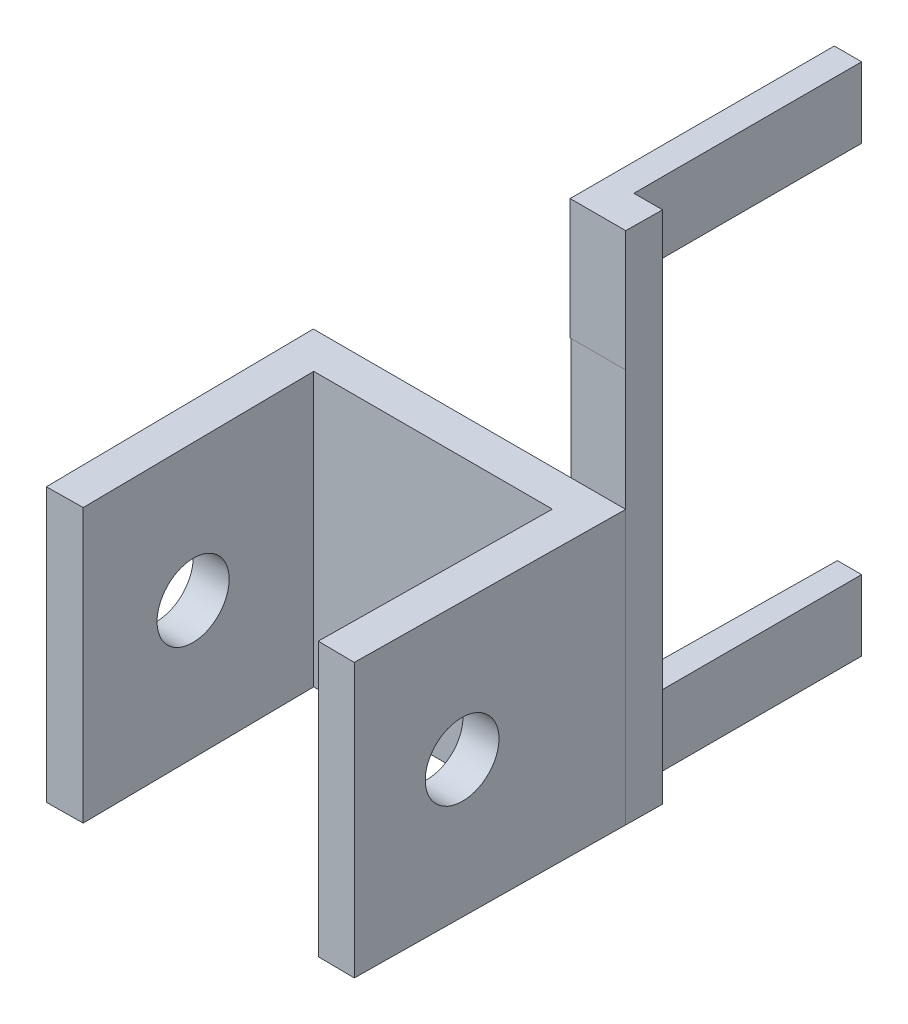
ISO-10303-21;
HEADER;
FILE_DESCRIPTION(('STEP AP214'),'2;1');
FILE_NAME('part.step','',(''),(''),'','','');
FILE_SCHEMA(('AUTOMOTIVE_DESIGN { 1 0 10303 214 1 1 1 1 }'));
ENDSEC;
DATA;
#1=APPLICATION_CONTEXT('core data for automotive mechanical design processes');
#2=APPLICATION_PROTOCOL_DEFINITION('international standard','automotive_design',2000,#1);
#3=PRODUCT_CONTEXT('',#1,'mechanical');
#4=PRODUCT('Part','Part','',(#3));
#5=PRODUCT_RELATED_PRODUCT_CATEGORY('part','',(#4));
#6=PRODUCT_DEFINITION_FORMATION('','',#4);
#7=PRODUCT_DEFINITION_CONTEXT('part definition',#1,'design');
#8=PRODUCT_DEFINITION('design','',#6,#7);
#9=PRODUCT_DEFINITION_SHAPE('','',#8);
#10=(LENGTH_UNIT() NAMED_UNIT(*) SI_UNIT(.MILLI.,.METRE.));
#11=(NAMED_UNIT(*) PLANE_ANGLE_UNIT() SI_UNIT($,.RADIAN.));
#12=(NAMED_UNIT(*) SI_UNIT($,.STERADIAN.) SOLID_ANGLE_UNIT());
#13=UNCERTAINTY_MEASURE_WITH_UNIT(LENGTH_MEASURE(1.E-05),#10,'distance_accuracy_value','');
#14=(GEOMETRIC_REPRESENTATION_CONTEXT(3) GLOBAL_UNCERTAINTY_ASSIGNED_CONTEXT((#13)) GLOBAL_UNIT_ASSIGNED_CONTEXT((#10,
#11,#12)) REPRESENTATION_CONTEXT('',''));
#15=CARTESIAN_POINT('',(0.,0.,0.));
#16=DIRECTION('',(0.,0.,1.));
#17=DIRECTION('',(1.,0.,0.));
#18=AXIS2_PLACEMENT_3D('',#15,#16,#17);
#19=CARTESIAN_POINT('',(28.338155167548,26.2685783752968,31.8283811231663));
#20=DIRECTION('',(0.,0.,-1.));
#21=DIRECTION('',(1.,0.,0.));
#22=AXIS2_PLACEMENT_3D('',#19,#20,#21);
#23=PLANE('',#22);
#24=DIRECTION('',(0.,1.,0.));
#25=VECTOR('',#24,1.);
#26=CARTESIAN_POINT('',(26.2379684492767,61.7685783752968,31.8283811231663));
#27=LINE('',#26,#25);
#28=CARTESIAN_POINT('',(26.2379684492767,56.2685783752968,31.8283811231663));
#29=VERTEX_POINT('',#28);
#30=CARTESIAN_POINT('',(26.2379684492767,69.5185783752968,31.8283811231663));
#31=VERTEX_POINT('',#30);
#32=EDGE_CURVE('P0_E219',#29,#31,#27,.T.);
#33=ORIENTED_EDGE('',*,*,#32,.F.);
#34=DIRECTION('',(-1.,0.,0.));
#35=VECTOR('',#34,1.);
#36=CARTESIAN_POINT('',(15.238155167548,56.2685783752968,31.8283811231663));
#37=LINE('',#36,#35);
#38=CARTESIAN_POINT('',(32.3384298163221,56.2685783752968,31.8283811231663));
#39=VERTEX_POINT('',#38);
#40=EDGE_CURVE('P0_E147',#39,#29,#37,.T.);
#41=ORIENTED_EDGE('',*,*,#40,.F.);
#42=DIRECTION('',(0.,1.,0.));
#43=VECTOR('',#42,1.);
#44=CARTESIAN_POINT('',(32.3384298163221,69.5185783752968,31.8283811231663));
#45=LINE('',#44,#43);
#46=CARTESIAN_POINT('',(32.3384298163221,69.5185783752968,31.8283811231663));
#47=VERTEX_POINT('',#46);
#48=EDGE_CURVE('P0_E174',#39,#47,#45,.T.);
#49=ORIENTED_EDGE('',*,*,#48,.T.);
#50=DIRECTION('',(1.,0.,0.));
#51=VECTOR('',#50,1.);
#52=CARTESIAN_POINT('',(26.2379684492767,69.5185783752968,31.8283811231663));
#53=LINE('',#52,#51);
#54=EDGE_CURVE('P0_E167',#31,#47,#53,.T.);
#55=ORIENTED_EDGE('',*,*,#54,.F.);
#56=EDGE_LOOP('',(#33,#41,#49,#55));
#57=FACE_BOUND('',#56,.T.);
#58=ADVANCED_FACE('P0_F16',(#57),#23,.F.);
#59=CARTESIAN_POINT('',(29.2379684492767,20.7685783752968,31.8283811231663));
#60=DIRECTION('',(1.,0.,0.));
#61=DIRECTION('',(0.,0.,1.));
#62=AXIS2_PLACEMENT_3D('',#59,#60,#61);
#63=PLANE('',#62);
#64=DIRECTION('',(0.,0.,1.));
#65=VECTOR('',#64,1.);
#66=CARTESIAN_POINT('',(29.2379684492767,69.5185783752968,2.82838112316626));
#67=LINE('',#66,#65);
#68=CARTESIAN_POINT('',(29.2379684492767,69.5185783752968,2.82838112316626));
#69=VERTEX_POINT('',#68);
#70=CARTESIAN_POINT('',(29.2379684492767,69.5185783752968,27.8283811231663));
#71=VERTEX_POINT('',#70);
#72=EDGE_CURVE('P0_E39',#69,#71,#67,.T.);
#73=ORIENTED_EDGE('',*,*,#72,.T.);
#74=DIRECTION('',(0.,1.,0.));
#75=VECTOR('',#74,1.);
#76=CARTESIAN_POINT('',(29.2379684492767,13.0185783752968,27.8283811231663));
#77=LINE('',#76,#75);
#78=CARTESIAN_POINT('',(29.2379684492767,61.7685783752968,27.8283811231663));
#79=VERTEX_POINT('',#78);
#80=EDGE_CURVE('P0_E152',#79,#71,#77,.T.);
#81=ORIENTED_EDGE('',*,*,#80,.F.);
#82=DIRECTION('',(0.,0.,1.));
#83=VECTOR('',#82,1.);
#84=CARTESIAN_POINT('',(29.2379684492767,61.7685783752968,2.82838112316626));
#85=LINE('',#84,#83);
#86=CARTESIAN_POINT('',(29.2379684492767,61.7685783752968,2.82838112316626));
#87=VERTEX_POINT('',#86);
#88=EDGE_CURVE('P0_E189',#87,#79,#85,.T.);
#89=ORIENTED_EDGE('',*,*,#88,.F.);
#90=DIRECTION('',(0.,-1.,0.));
#91=VECTOR('',#90,1.);
#92=CARTESIAN_POINT('',(29.2379684492767,61.7685783752968,2.82838112316626));
#93=LINE('',#92,#91);
#94=EDGE_CURVE('P0_E183',#69,#87,#93,.T.);
#95=ORIENTED_EDGE('',*,*,#94,.F.);
#96=EDGE_LOOP('',(#73,#81,#89,#95));
#97=FACE_BOUND('',#96,.T.);
#98=ADVANCED_FACE('P0_F289',(#97),#63,.T.);
#99=DIRECTION('',(0.,0.,1.));
#100=VECTOR('',#99,1.);
#101=CARTESIAN_POINT('',(29.2379684492767,20.7685783752968,2.82838112316626));
#102=LINE('',#101,#100);
#103=CARTESIAN_POINT('',(29.2379684492767,20.7685783752968,2.82838112316626));
#104=VERTEX_POINT('',#103);
#105=CARTESIAN_POINT('',(29.2379684492767,20.7685783752968,27.8283811231663));
#106=VERTEX_POINT('',#105);
#107=EDGE_CURVE('P0_E211',#104,#106,#102,.T.);
#108=ORIENTED_EDGE('',*,*,#107,.T.);
#109=CARTESIAN_POINT('',(29.2379684492767,13.0185783752968,27.8283811231663));
#110=VERTEX_POINT('',#109);
#111=EDGE_CURVE('P0_E155',#110,#106,#77,.T.);
#112=ORIENTED_EDGE('',*,*,#111,.F.);
#113=DIRECTION('',(0.,0.,1.));
#114=VECTOR('',#113,1.);
#115=CARTESIAN_POINT('',(29.2379684492767,13.0185783752968,2.82838112316626));
#116=LINE('',#115,#114);
#117=CARTESIAN_POINT('',(29.2379684492767,13.0185783752968,2.82838112316626));
#118=VERTEX_POINT('',#117);
#119=EDGE_CURVE('P0_E208',#118,#110,#116,.T.);
#120=ORIENTED_EDGE('',*,*,#119,.F.);
#121=DIRECTION('',(0.,-1.,0.));
#122=VECTOR('',#121,1.);
#123=CARTESIAN_POINT('',(29.2379684492767,20.7685783752968,2.82838112316626));
#124=LINE('',#123,#122);
#125=EDGE_CURVE('P0_E201',#104,#118,#124,.T.);
#126=ORIENTED_EDGE('',*,*,#125,.F.);
#127=EDGE_LOOP('',(#108,#112,#120,#126));
#128=FACE_BOUND('',#127,.T.);
#129=ADVANCED_FACE('P0_F260',(#128),#63,.T.);
#130=DIRECTION('',(-1.,0.,0.));
#131=VECTOR('',#130,1.);
#132=CARTESIAN_POINT('',(15.238155167548,26.2685783752968,31.8283811231663));
#133=LINE('',#132,#131);
#134=CARTESIAN_POINT('',(32.3384298163221,26.2685783752968,31.8283811231663));
#135=VERTEX_POINT('',#134);
#136=CARTESIAN_POINT('',(26.2379684492767,26.2685783752968,31.8283811231663));
#137=VERTEX_POINT('',#136);
#138=EDGE_CURVE('P0_E218',#135,#137,#133,.T.);
#139=ORIENTED_EDGE('',*,*,#138,.T.);
#140=CARTESIAN_POINT('',(26.2379684492767,13.0185783752968,31.8283811231663));
#141=VERTEX_POINT('',#140);
#142=EDGE_CURVE('P0_E215',#141,#137,#27,.T.);
#143=ORIENTED_EDGE('',*,*,#142,.F.);
#144=DIRECTION('',(-1.,0.,0.));
#145=VECTOR('',#144,1.);
#146=CARTESIAN_POINT('',(26.2379684492767,13.0185783752968,31.8283811231663));
#147=LINE('',#146,#145);
#148=CARTESIAN_POINT('',(32.3384298163221,13.0185783752968,31.8283811231663));
#149=VERTEX_POINT('',#148);
#150=EDGE_CURVE('P0_E196',#149,#141,#147,.T.);
#151=ORIENTED_EDGE('',*,*,#150,.F.);
#152=EDGE_CURVE('P0_E165',#149,#135,#45,.T.);
#153=ORIENTED_EDGE('',*,*,#152,.T.);
#154=EDGE_LOOP('',(#139,#143,#151,#153));
#155=FACE_BOUND('',#154,.T.);
#156=ADVANCED_FACE('P0_F18',(#155),#23,.F.);
#157=CARTESIAN_POINT('',(32.3853048163221,26.2685783752968,27.8283811231663));
#158=DIRECTION('',(0.,0.,1.));
#159=DIRECTION('',(-1.,0.,0.));
#160=AXIS2_PLACEMENT_3D('',#157,#158,#159);
#161=PLANE('',#160);
#162=DIRECTION('',(0.,1.,0.));
#163=VECTOR('',#162,1.);
#164=CARTESIAN_POINT('',(26.2840056783981,26.2685783752968,27.8283811231663));
#165=LINE('',#164,#163);
#166=CARTESIAN_POINT('',(26.2840056783981,20.7685783752968,27.8283811231663));
#167=VERTEX_POINT('',#166);
#168=CARTESIAN_POINT('',(26.2840056783981,56.2685783752968,27.8283811231663));
#169=VERTEX_POINT('',#168);
#170=EDGE_CURVE('P0_E268',#167,#169,#165,.T.);
#171=ORIENTED_EDGE('',*,*,#170,.T.);
#172=DIRECTION('',(-0.956445869362801,0.291909744576703,0.));
#173=VECTOR('',#172,1.);
#174=CARTESIAN_POINT('',(40.2412812741353,52.008781888484,27.8283811231663));
#175=LINE('',#174,#173);
#176=CARTESIAN_POINT('',(26.2379684492767,56.282629056286,27.8283811231663));
#177=VERTEX_POINT('',#176);
#178=EDGE_CURVE('P0_E124',#169,#177,#175,.T.);
#179=ORIENTED_EDGE('',*,*,#178,.T.);
#180=DIRECTION('',(0.,1.,0.));
#181=VECTOR('',#180,1.);
#182=CARTESIAN_POINT('',(26.2379684492767,61.7685783752968,27.8283811231663));
#183=LINE('',#182,#181);
#184=CARTESIAN_POINT('',(26.2379684492767,61.7685783752968,27.8283811231663));
#185=VERTEX_POINT('',#184);
#186=EDGE_CURVE('P0_E141',#177,#185,#183,.T.);
#187=ORIENTED_EDGE('',*,*,#186,.T.);
#188=DIRECTION('',(1.,0.,0.));
#189=VECTOR('',#188,1.);
#190=CARTESIAN_POINT('',(26.2379684492767,61.7685783752968,27.8283811231663));
#191=LINE('',#190,#189);
#192=EDGE_CURVE('P0_E214',#185,#79,#191,.T.);
#193=ORIENTED_EDGE('',*,*,#192,.T.);
#194=ORIENTED_EDGE('',*,*,#80,.T.);
#195=DIRECTION('',(-1.,0.,0.));
#196=VECTOR('',#195,1.);
#197=CARTESIAN_POINT('',(89.0052278210073,69.5185783752968,27.8283811231663));
#198=LINE('',#197,#196);
#199=CARTESIAN_POINT('',(32.3853048163221,69.5185783752968,27.8283811231663));
#200=VERTEX_POINT('',#199);
#201=EDGE_CURVE('P0_E169',#200,#71,#198,.T.);
#202=ORIENTED_EDGE('',*,*,#201,.F.);
#203=DIRECTION('',(0.,1.,0.));
#204=VECTOR('',#203,1.);
#205=CARTESIAN_POINT('',(32.3853048163221,26.2685783752968,27.8283811231663));
#206=LINE('',#205,#204);
#207=CARTESIAN_POINT('',(32.3853048163221,13.0185783752968,27.8283811231663));
#208=VERTEX_POINT('',#207);
#209=EDGE_CURVE('P0_E230',#208,#200,#206,.T.);
#210=ORIENTED_EDGE('',*,*,#209,.F.);
#211=DIRECTION('',(-1.,0.,0.));
#212=VECTOR('',#211,1.);
#213=CARTESIAN_POINT('',(89.0052278210073,13.0185783752968,27.8283811231662));
#214=LINE('',#213,#212);
#215=EDGE_CURVE('P0_E172',#208,#110,#214,.T.);
#216=ORIENTED_EDGE('',*,*,#215,.T.);
#217=ORIENTED_EDGE('',*,*,#111,.T.);
#218=DIRECTION('',(-1.,0.,0.));
#219=VECTOR('',#218,1.);
#220=CARTESIAN_POINT('',(26.2379684492767,20.7685783752968,27.8283811231663));
#221=LINE('',#220,#219);
#222=EDGE_CURVE('P0_E222',#106,#167,#221,.T.);
#223=ORIENTED_EDGE('',*,*,#222,.T.);
#224=EDGE_LOOP('',(#171,#179,#187,#193,#194,#202,#210,#216,#217,#223));
#225=FACE_BOUND('',#224,.T.);
#226=ADVANCED_FACE('P0_F241',(#225),#161,.F.);
#227=CARTESIAN_POINT('',(32.0378805376306,26.2685783752968,57.4752529048469));
#228=DIRECTION('',(-0.99993134252064,0.,-0.0117179454201636));
#229=DIRECTION('',(0.0117179454201636,0.,-0.99993134252064));
#230=AXIS2_PLACEMENT_3D('',#227,#228,#229);
#231=PLANE('',#230);
#232=ORIENTED_EDGE('',*,*,#48,.F.);
#233=DIRECTION('',(0.,1.,0.));
#234=VECTOR('',#233,1.);
#235=CARTESIAN_POINT('',(32.3384298163221,26.2685783752968,31.8283811231663));
#236=LINE('',#235,#234);
#237=EDGE_CURVE('P0_E151',#135,#39,#236,.T.);
#238=ORIENTED_EDGE('',*,*,#237,.F.);
#239=ORIENTED_EDGE('',*,*,#152,.F.);
#240=DIRECTION('',(-0.0117179454201636,0.,0.99993134252064));
#241=VECTOR('',#240,1.);
#242=CARTESIAN_POINT('',(32.3462107482322,13.0185783752968,31.1644082668447));
#243=LINE('',#242,#241);
#244=EDGE_CURVE('P0_E164',#208,#149,#243,.T.);
#245=ORIENTED_EDGE('',*,*,#244,.F.);
#246=ORIENTED_EDGE('',*,*,#209,.T.);
#247=DIRECTION('',(0.0117179454201636,0.,-0.99993134252064));
#248=VECTOR('',#247,1.);
#249=CARTESIAN_POINT('',(32.3462107482322,69.5185783752968,31.1644082668447));
#250=LINE('',#249,#248);
#251=EDGE_CURVE('P0_E161',#47,#200,#250,.T.);
#252=ORIENTED_EDGE('',*,*,#251,.F.);
#253=EDGE_LOOP('',(#232,#238,#239,#245,#246,#252));
#254=FACE_BOUND('',#253,.T.);
#255=ADVANCED_FACE('P0_F237',(#254),#231,.F.);
#256=CARTESIAN_POINT('',(26.2379684492767,61.7685783752968,31.8283811231663));
#257=DIRECTION('',(-1.,0.,0.));
#258=DIRECTION('',(0.,-1.,0.));
#259=AXIS2_PLACEMENT_3D('',#256,#257,#258);
#260=PLANE('',#259);
#261=DIRECTION('',(0.,0.00357656982948041,-0.999993604053673));
#262=VECTOR('',#261,1.);
#263=CARTESIAN_POINT('',(26.2379684492767,56.2683930439206,31.808709200433));
#264=LINE('',#263,#262);
#265=CARTESIAN_POINT('',(26.2379684492767,56.2685783752968,31.7568913415212));
#266=VERTEX_POINT('',#265);
#267=EDGE_CURVE('P0_E10',#266,#177,#264,.T.);
#268=ORIENTED_EDGE('',*,*,#267,.F.);
#269=DIRECTION('',(0.,0.,-1.));
#270=VECTOR('',#269,1.);
#271=CARTESIAN_POINT('',(26.2379684492767,56.2685783752968,44.6283811231663));
#272=LINE('',#271,#270);
#273=EDGE_CURVE('P0_E133',#29,#266,#272,.T.);
#274=ORIENTED_EDGE('',*,*,#273,.F.);
#275=ORIENTED_EDGE('',*,*,#32,.T.);
#276=DIRECTION('',(0.,0.,1.));
#277=VECTOR('',#276,1.);
#278=CARTESIAN_POINT('',(26.2379684492767,69.5185783752968,2.82838112316627));
#279=LINE('',#278,#277);
#280=CARTESIAN_POINT('',(26.2379684492767,69.5185783752968,2.82838112316627));
#281=VERTEX_POINT('',#280);
#282=EDGE_CURVE('P0_E193',#281,#31,#279,.T.);
#283=ORIENTED_EDGE('',*,*,#282,.F.);
#284=DIRECTION('',(0.,1.,0.));
#285=VECTOR('',#284,1.);
#286=CARTESIAN_POINT('',(26.2379684492767,61.7685783752968,2.82838112316627));
#287=LINE('',#286,#285);
#288=CARTESIAN_POINT('',(26.2379684492767,61.7685783752968,2.82838112316627));
#289=VERTEX_POINT('',#288);
#290=EDGE_CURVE('P0_E178',#289,#281,#287,.T.);
#291=ORIENTED_EDGE('',*,*,#290,.F.);
#292=DIRECTION('',(0.,0.,1.));
#293=VECTOR('',#292,1.);
#294=CARTESIAN_POINT('',(26.2379684492767,61.7685783752968,2.82838112316627));
#295=LINE('',#294,#293);
#296=EDGE_CURVE('P0_E187',#289,#185,#295,.T.);
#297=ORIENTED_EDGE('',*,*,#296,.T.);
#298=ORIENTED_EDGE('',*,*,#186,.F.);
#299=EDGE_LOOP('',(#268,#274,#275,#283,#291,#297,#298));
#300=FACE_BOUND('',#299,.T.);
#301=ADVANCED_FACE('P0_F138',(#300),#260,.T.);
#302=DIRECTION('',(0.,1.,0.));
#303=VECTOR('',#302,1.);
#304=CARTESIAN_POINT('',(26.2379684492767,56.2685783752968,31.7568913415212));
#305=LINE('',#304,#303);
#306=CARTESIAN_POINT('',(26.2379684492767,13.0185783752968,31.7568913415212));
#307=VERTEX_POINT('',#306);
#308=CARTESIAN_POINT('',(26.2379684492767,26.2685783752968,31.7568913415212));
#309=VERTEX_POINT('',#308);
#310=EDGE_CURVE('P0_E31',#307,#309,#305,.T.);
#311=ORIENTED_EDGE('',*,*,#310,.F.);
#312=DIRECTION('',(0.,0.,1.));
#313=VECTOR('',#312,1.);
#314=CARTESIAN_POINT('',(26.2379684492767,13.0185783752968,2.82838112316627));
#315=LINE('',#314,#313);
#316=EDGE_CURVE('P0_E206',#307,#141,#315,.T.);
#317=ORIENTED_EDGE('',*,*,#316,.T.);
#318=ORIENTED_EDGE('',*,*,#142,.T.);
#319=DIRECTION('',(0.,0.,-1.));
#320=VECTOR('',#319,1.);
#321=CARTESIAN_POINT('',(26.2379684492767,26.2685783752968,44.6283811231663));
#322=LINE('',#321,#320);
#323=EDGE_CURVE('P0_E227',#137,#309,#322,.T.);
#324=ORIENTED_EDGE('',*,*,#323,.T.);
#325=EDGE_LOOP('',(#311,#317,#318,#324));
#326=FACE_BOUND('',#325,.T.);
#327=ADVANCED_FACE('P0_F303',(#326),#260,.T.);
#328=CARTESIAN_POINT('',(26.2379684492767,20.7685783752968,2.82838112316627));
#329=DIRECTION('',(0.,-1.,0.));
#330=DIRECTION('',(0.,0.,1.));
#331=AXIS2_PLACEMENT_3D('',#328,#329,#330);
#332=PLANE('',#331);
#333=DIRECTION('',(1.,0.,0.));
#334=VECTOR('',#333,1.);
#335=CARTESIAN_POINT('',(26.2379684492767,20.7685783752968,2.82838112316627));
#336=LINE('',#335,#334);
#337=CARTESIAN_POINT('',(26.5769744283981,20.7685783752968,2.82838112316627));
#338=VERTEX_POINT('',#337);
#339=EDGE_CURVE('P0_E199',#338,#104,#336,.T.);
#340=ORIENTED_EDGE('',*,*,#339,.F.);
#341=DIRECTION('',(-0.0117179454201636,0.,0.99993134252064));
#342=VECTOR('',#341,1.);
#343=CARTESIAN_POINT('',(26.5769278794041,20.7685783752968,2.83235330398807));
#344=LINE('',#343,#342);
#345=EDGE_CURVE('P0_E267',#338,#167,#344,.T.);
#346=ORIENTED_EDGE('',*,*,#345,.T.);
#347=ORIENTED_EDGE('',*,*,#222,.F.);
#348=ORIENTED_EDGE('',*,*,#107,.F.);
#349=EDGE_LOOP('',(#340,#346,#347,#348));
#350=FACE_BOUND('',#349,.T.);
#351=ADVANCED_FACE('P0_F265',(#350),#332,.F.);
#352=CARTESIAN_POINT('',(26.2379684492767,13.0185783752968,2.82838112316627));
#353=DIRECTION('',(0.,1.,0.));
#354=DIRECTION('',(0.,0.,-1.));
#355=AXIS2_PLACEMENT_3D('',#352,#353,#354);
#356=PLANE('',#355);
#357=ORIENTED_EDGE('',*,*,#316,.F.);
#358=DIRECTION('',(0.0117179454201636,0.,-0.99993134252064));
#359=VECTOR('',#358,1.);
#360=CARTESIAN_POINT('',(26.5769278794041,13.0185783752968,2.83235330398807));
#361=LINE('',#360,#359);
#362=CARTESIAN_POINT('',(26.5769744283981,13.0185783752968,2.82838112316627));
#363=VERTEX_POINT('',#362);
#364=EDGE_CURVE('P0_E270',#307,#363,#361,.T.);
#365=ORIENTED_EDGE('',*,*,#364,.T.);
#366=DIRECTION('',(-1.,0.,0.));
#367=VECTOR('',#366,1.);
#368=CARTESIAN_POINT('',(26.2379684492767,13.0185783752968,2.82838112316627));
#369=LINE('',#368,#367);
#370=EDGE_CURVE('P0_E203',#118,#363,#369,.T.);
#371=ORIENTED_EDGE('',*,*,#370,.F.);
#372=ORIENTED_EDGE('',*,*,#119,.T.);
#373=ORIENTED_EDGE('',*,*,#215,.F.);
#374=ORIENTED_EDGE('',*,*,#244,.T.);
#375=ORIENTED_EDGE('',*,*,#150,.T.);
#376=EDGE_LOOP('',(#357,#365,#371,#372,#373,#374,#375));
#377=FACE_BOUND('',#376,.T.);
#378=ADVANCED_FACE('P0_F253',(#377),#356,.F.);
#379=CARTESIAN_POINT('',(15.238155167548,56.2685783752968,2.82838112316627));
#380=DIRECTION('',(0.,0.,-1.));
#381=DIRECTION('',(1.,0.,0.));
#382=AXIS2_PLACEMENT_3D('',#379,#380,#381);
#383=PLANE('',#382);
#384=DIRECTION('',(0.,-1.,0.));
#385=VECTOR('',#384,1.);
#386=CARTESIAN_POINT('',(26.5769744283981,56.2685783752968,2.82838112316627));
#387=LINE('',#386,#385);
#388=EDGE_CURVE('P0_E126',#338,#363,#387,.T.);
#389=ORIENTED_EDGE('',*,*,#388,.F.);
#390=ORIENTED_EDGE('',*,*,#339,.T.);
#391=ORIENTED_EDGE('',*,*,#125,.T.);
#392=ORIENTED_EDGE('',*,*,#370,.T.);
#393=EDGE_LOOP('',(#389,#390,#391,#392));
#394=FACE_BOUND('',#393,.T.);
#395=ADVANCED_FACE('P0_F277',(#394),#383,.T.);
#396=CARTESIAN_POINT('',(26.2379684492767,69.5185783752968,2.82838112316627));
#397=DIRECTION('',(0.,-1.,0.));
#398=DIRECTION('',(0.,0.,1.));
#399=AXIS2_PLACEMENT_3D('',#396,#397,#398);
#400=PLANE('',#399);
#401=ORIENTED_EDGE('',*,*,#282,.T.);
#402=ORIENTED_EDGE('',*,*,#54,.T.);
#403=ORIENTED_EDGE('',*,*,#251,.T.);
#404=ORIENTED_EDGE('',*,*,#201,.T.);
#405=ORIENTED_EDGE('',*,*,#72,.F.);
#406=DIRECTION('',(1.,0.,0.));
#407=VECTOR('',#406,1.);
#408=CARTESIAN_POINT('',(26.2379684492767,69.5185783752968,2.82838112316627));
#409=LINE('',#408,#407);
#410=EDGE_CURVE('P0_E181',#281,#69,#409,.T.);
#411=ORIENTED_EDGE('',*,*,#410,.F.);
#412=EDGE_LOOP('',(#401,#402,#403,#404,#405,#411));
#413=FACE_BOUND('',#412,.T.);
#414=ADVANCED_FACE('P0_F243',(#413),#400,.F.);
#415=CARTESIAN_POINT('',(26.2379684492767,61.7685783752968,2.82838112316627));
#416=DIRECTION('',(0.,1.,0.));
#417=DIRECTION('',(0.,0.,-1.));
#418=AXIS2_PLACEMENT_3D('',#415,#416,#417);
#419=PLANE('',#418);
#420=ORIENTED_EDGE('',*,*,#192,.F.);
#421=ORIENTED_EDGE('',*,*,#296,.F.);
#422=DIRECTION('',(-1.,0.,0.));
#423=VECTOR('',#422,1.);
#424=CARTESIAN_POINT('',(26.2379684492767,61.7685783752968,2.82838112316627));
#425=LINE('',#424,#423);
#426=EDGE_CURVE('P0_E185',#87,#289,#425,.T.);
#427=ORIENTED_EDGE('',*,*,#426,.F.);
#428=ORIENTED_EDGE('',*,*,#88,.T.);
#429=EDGE_LOOP('',(#420,#421,#427,#428));
#430=FACE_BOUND('',#429,.T.);
#431=ADVANCED_FACE('P0_F285',(#430),#419,.F.);
#432=CARTESIAN_POINT('',(15.238155167548,56.2685783752968,2.82838112316627));
#433=DIRECTION('',(0.,0.,-1.));
#434=DIRECTION('',(1.,0.,0.));
#435=AXIS2_PLACEMENT_3D('',#432,#433,#434);
#436=PLANE('',#435);
#437=ORIENTED_EDGE('',*,*,#290,.T.);
#438=ORIENTED_EDGE('',*,*,#410,.T.);
#439=ORIENTED_EDGE('',*,*,#94,.T.);
#440=ORIENTED_EDGE('',*,*,#426,.T.);
#441=EDGE_LOOP('',(#437,#438,#439,#440));
#442=FACE_BOUND('',#441,.T.);
#443=ADVANCED_FACE('P0_F328',(#442),#436,.T.);
#444=CARTESIAN_POINT('',(-14.658343282148,26.2685783752968,31.2776376884186));
#445=DIRECTION('',(0.0117179454201636,0.,-0.99993134252064));
#446=DIRECTION('',(0.99993134252064,0.,0.0117179454201636));
#447=AXIS2_PLACEMENT_3D('',#444,#445,#446);
#448=PLANE('',#447);
#449=DIRECTION('',(0.99993134252064,0.,0.0117179454201636));
#450=VECTOR('',#449,1.);
#451=CARTESIAN_POINT('',(-14.658343282148,56.2685783752968,31.2776376884186));
#452=LINE('',#451,#450);
#453=EDGE_CURVE('P0_E144',#266,#39,#452,.T.);
#454=ORIENTED_EDGE('',*,*,#453,.F.);
#455=DIRECTION('',(0.,-1.,0.));
#456=VECTOR('',#455,1.);
#457=CARTESIAN_POINT('',(26.2379684492767,26.2685783752968,31.7568913415212));
#458=LINE('',#457,#456);
#459=EDGE_CURVE('P0_E24',#266,#309,#458,.T.);
#460=ORIENTED_EDGE('',*,*,#459,.T.);
#461=DIRECTION('',(0.99993134252064,0.,0.0117179454201636));
#462=VECTOR('',#461,1.);
#463=CARTESIAN_POINT('',(-14.658343282148,26.2685783752968,31.2776376884186));
#464=LINE('',#463,#462);
#465=EDGE_CURVE('P0_E153',#309,#135,#464,.T.);
#466=ORIENTED_EDGE('',*,*,#465,.T.);
#467=ORIENTED_EDGE('',*,*,#237,.T.);
#468=EDGE_LOOP('',(#454,#460,#466,#467));
#469=FACE_BOUND('',#468,.T.);
#470=ADVANCED_FACE('P0_F149',(#469),#448,.F.);
#471=CARTESIAN_POINT('',(-14.658343282148,56.2685783752968,31.2776376884186));
#472=DIRECTION('',(0.,1.,0.));
#473=DIRECTION('',(0.,0.,-1.));
#474=AXIS2_PLACEMENT_3D('',#471,#472,#473);
#475=PLANE('',#474);
#476=ORIENTED_EDGE('',*,*,#40,.T.);
#477=ORIENTED_EDGE('',*,*,#273,.T.);
#478=ORIENTED_EDGE('',*,*,#453,.T.);
#479=EDGE_LOOP('',(#476,#477,#478));
#480=FACE_BOUND('',#479,.T.);
#481=ADVANCED_FACE('P0_F143',(#480),#475,.F.);
#482=CARTESIAN_POINT('',(-14.9959516984278,26.2685783752968,60.0868892109664));
#483=DIRECTION('',(0.,-1.,0.));
#484=DIRECTION('',(0.,0.,1.));
#485=AXIS2_PLACEMENT_3D('',#482,#483,#484);
#486=PLANE('',#485);
#487=ORIENTED_EDGE('',*,*,#465,.F.);
#488=ORIENTED_EDGE('',*,*,#323,.F.);
#489=ORIENTED_EDGE('',*,*,#138,.F.);
#490=EDGE_LOOP('',(#487,#488,#489));
#491=FACE_BOUND('',#490,.T.);
#492=ADVANCED_FACE('P0_F317',(#491),#486,.F.);
#493=CARTESIAN_POINT('',(-8.02420265687135,66.895028744257,-15.647845599225));
#494=DIRECTION('',(0.291908036629071,0.956440273251375,0.00342079730424673));
#495=DIRECTION('',(-0.956445869362801,0.291909744576703,0.));
#496=AXIS2_PLACEMENT_3D('',#493,#494,#495);
#497=PLANE('',#496);
#498=DIRECTION('',(-0.0117179454201636,0.,0.99993134252064));
#499=VECTOR('',#498,1.);
#500=CARTESIAN_POINT('',(26.7887118840244,56.2685783752968,-15.2398817569489));
#501=LINE('',#500,#499);
#502=EDGE_CURVE('P0_E120',#169,#266,#501,.T.);
#503=ORIENTED_EDGE('',*,*,#502,.T.);
#504=ORIENTED_EDGE('',*,*,#267,.T.);
#505=ORIENTED_EDGE('',*,*,#178,.F.);
#506=EDGE_LOOP('',(#503,#504,#505));
#507=FACE_BOUND('',#506,.T.);
#508=ADVANCED_FACE('P0_F121',(#507),#497,.F.);
#509=CARTESIAN_POINT('',(26.7887118840244,56.2685783752968,-15.2398817569489));
#510=DIRECTION('',(0.99993134252064,0.,0.0117179454201636));
#511=DIRECTION('',(-0.0117179454201636,0.,0.99993134252064));
#512=AXIS2_PLACEMENT_3D('',#509,#510,#511);
#513=PLANE('',#512);
#514=ORIENTED_EDGE('',*,*,#345,.F.);
#515=ORIENTED_EDGE('',*,*,#388,.T.);
#516=ORIENTED_EDGE('',*,*,#364,.F.);
#517=ORIENTED_EDGE('',*,*,#310,.T.);
#518=ORIENTED_EDGE('',*,*,#459,.F.);
#519=ORIENTED_EDGE('',*,*,#502,.F.);
#520=ORIENTED_EDGE('',*,*,#170,.F.);
#521=EDGE_LOOP('',(#514,#515,#516,#517,#518,#519,#520));
#522=FACE_BOUND('',#521,.T.);
#523=ADVANCED_FACE('P0_F128',(#522),#513,.F.);
#524=CLOSED_SHELL('',(#58,#98,#129,#156,#226,#255,#301,#327,#351,#378,#395,#414,#431,#443,#470,
#481,#492,#508,#523));
#525=MANIFOLD_SOLID_BREP('P0_B1',#524);
#526=CARTESIAN_POINT('',(15.1909067310054,43.0185783752968,48.6283811231663));
#527=DIRECTION('',(0.,1.,0.));
#528=DIRECTION('',(0.,0.,1.));
#529=AXIS2_PLACEMENT_3D('',#526,#527,#528);
#530=PLANE('',#529);
#531=DIRECTION('',(-1.,0.,0.));
#532=VECTOR('',#531,1.);
#533=CARTESIAN_POINT('',(-1.9562429177687,43.0185783752968,31.8283811231663));
#534=LINE('',#533,#532);
#535=CARTESIAN_POINT('',(32.3384298163221,43.0185783752968,31.8283811231663));
#536=VERTEX_POINT('',#535);
#537=CARTESIAN_POINT('',(-1.95624291776871,43.0185783752968,31.8283811231663));
#538=VERTEX_POINT('',#537);
#539=EDGE_CURVE('P1_E104',#536,#538,#534,.T.);
#540=ORIENTED_EDGE('',*,*,#539,.T.);
#541=DIRECTION('',(0.0117179454201639,0.,0.99993134252064));
#542=VECTOR('',#541,1.);
#543=CARTESIAN_POINT('',(-1.60881863907713,43.0185783752968,61.4752529048469));
#544=LINE('',#543,#542);
#545=CARTESIAN_POINT('',(-1.60881863907713,43.0185783752968,61.4752529048469));
#546=VERTEX_POINT('',#545);
#547=EDGE_CURVE('P1_E35',#538,#546,#544,.T.);
#548=ORIENTED_EDGE('',*,*,#547,.T.);
#549=DIRECTION('',(0.999931342520641,0.,-0.0117179454201641));
#550=VECTOR('',#549,1.);
#551=CARTESIAN_POINT('',(-1.60881863907713,43.0185783752968,61.4752529048469));
#552=LINE('',#551,#550);
#553=CARTESIAN_POINT('',(2.39090673100543,43.0185783752968,61.4283811231663));
#554=VERTEX_POINT('',#553);
#555=EDGE_CURVE('P1_E128',#546,#554,#552,.T.);
#556=ORIENTED_EDGE('',*,*,#555,.T.);
#557=DIRECTION('',(-0.0117179454201639,0.,-0.99993134252064));
#558=VECTOR('',#557,1.);
#559=CARTESIAN_POINT('',(2.39090673100543,43.0185783752968,61.4283811231663));
#560=LINE('',#559,#558);
#561=CARTESIAN_POINT('',(2.09090673100543,43.0185783752968,35.8283811231663));
#562=VERTEX_POINT('',#561);
#563=EDGE_CURVE('P1_E75',#554,#562,#560,.T.);
#564=ORIENTED_EDGE('',*,*,#563,.T.);
#565=DIRECTION('',(1.,0.,0.));
#566=VECTOR('',#565,1.);
#567=CARTESIAN_POINT('',(2.09090673100543,43.0185783752968,35.8283811231663));
#568=LINE('',#567,#566);
#569=CARTESIAN_POINT('',(28.2909067310054,43.0185783752968,35.8283811231663));
#570=VERTEX_POINT('',#569);
#571=EDGE_CURVE('P1_E144',#562,#570,#568,.T.);
#572=ORIENTED_EDGE('',*,*,#571,.T.);
#573=DIRECTION('',(-0.0118101998876842,0.,0.999930257157274));
#574=VECTOR('',#573,1.);
#575=CARTESIAN_POINT('',(28.2909067310054,43.0185783752968,35.8283811231663));
#576=LINE('',#575,#574);
#577=CARTESIAN_POINT('',(27.9909067310054,43.0185783752968,61.2283811231663));
#578=VERTEX_POINT('',#577);
#579=EDGE_CURVE('P1_E90',#570,#578,#576,.T.);
#580=ORIENTED_EDGE('',*,*,#579,.T.);
#581=DIRECTION('',(0.999930257157274,0.,0.0118101998876842));
#582=VECTOR('',#581,1.);
#583=CARTESIAN_POINT('',(27.9909067310054,43.0185783752968,61.2283811231663));
#584=LINE('',#583,#582);
#585=CARTESIAN_POINT('',(31.9906277596345,43.0185783752968,61.275621922717));
#586=VERTEX_POINT('',#585);
#587=EDGE_CURVE('P1_E85',#578,#586,#584,.T.);
#588=ORIENTED_EDGE('',*,*,#587,.T.);
#589=DIRECTION('',(0.0118101998876842,0.,-0.999930257157274));
#590=VECTOR('',#589,1.);
#591=CARTESIAN_POINT('',(32.3384298163221,43.0185783752968,31.8283811231663));
#592=LINE('',#591,#590);
#593=EDGE_CURVE('P1_E88',#586,#536,#592,.T.);
#594=ORIENTED_EDGE('',*,*,#593,.T.);
#595=EDGE_LOOP('',(#540,#548,#556,#564,#572,#580,#588,#594));
#596=FACE_BOUND('',#595,.T.);
#597=ADVANCED_FACE('P1_F17',(#596),#530,.T.);
#598=CARTESIAN_POINT('',(15.1909067310054,13.0185783752968,48.6283811231663));
#599=DIRECTION('',(0.,1.,0.));
#600=DIRECTION('',(0.,0.,1.));
#601=AXIS2_PLACEMENT_3D('',#598,#599,#600);
#602=PLANE('',#601);
#603=DIRECTION('',(0.999930257157274,0.,0.0118101998876842));
#604=VECTOR('',#603,1.);
#605=CARTESIAN_POINT('',(27.9909067310054,13.0185783752968,61.2283811231663));
#606=LINE('',#605,#604);
#607=CARTESIAN_POINT('',(27.9909067310054,13.0185783752968,61.2283811231663));
#608=VERTEX_POINT('',#607);
#609=CARTESIAN_POINT('',(31.9906277596345,13.0185783752968,61.275621922717));
#610=VERTEX_POINT('',#609);
#611=EDGE_CURVE('P1_E98',#608,#610,#606,.T.);
#612=ORIENTED_EDGE('',*,*,#611,.F.);
#613=DIRECTION('',(-0.0118101998876842,0.,0.999930257157274));
#614=VECTOR('',#613,1.);
#615=CARTESIAN_POINT('',(28.2909067310054,13.0185783752968,35.8283811231663));
#616=LINE('',#615,#614);
#617=CARTESIAN_POINT('',(28.2909067310054,13.0185783752968,35.8283811231663));
#618=VERTEX_POINT('',#617);
#619=EDGE_CURVE('P1_E120',#618,#608,#616,.T.);
#620=ORIENTED_EDGE('',*,*,#619,.F.);
#621=DIRECTION('',(1.,0.,0.));
#622=VECTOR('',#621,1.);
#623=CARTESIAN_POINT('',(2.09090673100543,13.0185783752968,35.8283811231663));
#624=LINE('',#623,#622);
#625=CARTESIAN_POINT('',(2.09090673100543,13.0185783752968,35.8283811231663));
#626=VERTEX_POINT('',#625);
#627=EDGE_CURVE('P1_E118',#626,#618,#624,.T.);
#628=ORIENTED_EDGE('',*,*,#627,.F.);
#629=DIRECTION('',(-0.0117179454201639,0.,-0.99993134252064));
#630=VECTOR('',#629,1.);
#631=CARTESIAN_POINT('',(2.39090673100543,13.0185783752968,61.4283811231663));
#632=LINE('',#631,#630);
#633=CARTESIAN_POINT('',(2.39090673100543,13.0185783752968,61.4283811231663));
#634=VERTEX_POINT('',#633);
#635=EDGE_CURVE('P1_E114',#634,#626,#632,.T.);
#636=ORIENTED_EDGE('',*,*,#635,.F.);
#637=DIRECTION('',(0.999931342520641,0.,-0.0117179454201641));
#638=VECTOR('',#637,1.);
#639=CARTESIAN_POINT('',(-1.60881863907713,13.0185783752968,61.4752529048469));
#640=LINE('',#639,#638);
#641=CARTESIAN_POINT('',(-1.60881863907713,13.0185783752968,61.4752529048469));
#642=VERTEX_POINT('',#641);
#643=EDGE_CURVE('P1_E111',#642,#634,#640,.T.);
#644=ORIENTED_EDGE('',*,*,#643,.F.);
#645=DIRECTION('',(0.0117179454201639,0.,0.99993134252064));
#646=VECTOR('',#645,1.);
#647=CARTESIAN_POINT('',(-1.60881863907713,13.0185783752968,61.4752529048469));
#648=LINE('',#647,#646);
#649=CARTESIAN_POINT('',(-1.95624291776871,13.0185783752968,31.8283811231663));
#650=VERTEX_POINT('',#649);
#651=EDGE_CURVE('P1_E67',#650,#642,#648,.T.);
#652=ORIENTED_EDGE('',*,*,#651,.F.);
#653=DIRECTION('',(-1.,0.,0.));
#654=VECTOR('',#653,1.);
#655=CARTESIAN_POINT('',(-1.9562429177687,13.0185783752968,31.8283811231663));
#656=LINE('',#655,#654);
#657=CARTESIAN_POINT('',(32.3384298163221,13.0185783752968,31.8283811231663));
#658=VERTEX_POINT('',#657);
#659=EDGE_CURVE('P1_E124',#658,#650,#656,.T.);
#660=ORIENTED_EDGE('',*,*,#659,.F.);
#661=DIRECTION('',(0.0118101998876842,0.,-0.999930257157274));
#662=VECTOR('',#661,1.);
#663=CARTESIAN_POINT('',(32.3384298163221,13.0185783752968,31.8283811231663));
#664=LINE('',#663,#662);
#665=EDGE_CURVE('P1_E60',#610,#658,#664,.T.);
#666=ORIENTED_EDGE('',*,*,#665,.F.);
#667=EDGE_LOOP('',(#612,#620,#628,#636,#644,#652,#660,#666));
#668=FACE_BOUND('',#667,.T.);
#669=ADVANCED_FACE('P1_F153',(#668),#602,.F.);
#670=CARTESIAN_POINT('',(-1.60881863907713,43.0185783752968,61.4752529048469));
#671=DIRECTION('',(-0.0117179454201641,0.,-0.99993134252064));
#672=DIRECTION('',(-0.99993134252064,0.,0.0117179454201641));
#673=AXIS2_PLACEMENT_3D('',#670,#671,#672);
#674=PLANE('',#673);
#675=ORIENTED_EDGE('',*,*,#643,.T.);
#676=DIRECTION('',(0.,-1.,0.));
#677=VECTOR('',#676,1.);
#678=CARTESIAN_POINT('',(2.39090673100543,43.0185783752968,61.4283811231663));
#679=LINE('',#678,#677);
#680=EDGE_CURVE('P1_E11',#554,#634,#679,.T.);
#681=ORIENTED_EDGE('',*,*,#680,.F.);
#682=ORIENTED_EDGE('',*,*,#555,.F.);
#683=DIRECTION('',(0.,-1.,0.));
#684=VECTOR('',#683,1.);
#685=CARTESIAN_POINT('',(-1.60881863907713,43.0185783752968,61.4752529048469));
#686=LINE('',#685,#684);
#687=EDGE_CURVE('P1_E110',#546,#642,#686,.T.);
#688=ORIENTED_EDGE('',*,*,#687,.T.);
#689=EDGE_LOOP('',(#675,#681,#682,#688));
#690=FACE_BOUND('',#689,.T.);
#691=ADVANCED_FACE('P1_F19',(#690),#674,.F.);
#692=CARTESIAN_POINT('',(2.39090673100543,43.0185783752968,61.4283811231663));
#693=DIRECTION('',(-0.99993134252064,0.,0.0117179454201639));
#694=DIRECTION('',(0.0117179454201639,0.,0.99993134252064));
#695=AXIS2_PLACEMENT_3D('',#692,#693,#694);
#696=PLANE('',#695);
#697=CARTESIAN_POINT('',(2.24788093959256,28.0185783752968,49.2235135892675));
#698=DIRECTION('',(-0.99993134252064,0.,0.0117179454201639));
#699=DIRECTION('',(0.0117179454201639,0.,0.99993134252064));
#700=AXIS2_PLACEMENT_3D('',#697,#698,#699);
#701=ELLIPSE('',#700,4.00110745377421,4.);
#702=CARTESIAN_POINT('',(2.29476569835609,28.0185783752968,53.2243463370893));
#703=VERTEX_POINT('',#702);
#704=EDGE_CURVE('P1_E115',#703,#703,#701,.T.);
#705=ORIENTED_EDGE('',*,*,#704,.T.);
#706=EDGE_LOOP('',(#705));
#707=FACE_BOUND('',#706,.T.);
#708=ORIENTED_EDGE('',*,*,#635,.T.);
#709=DIRECTION('',(0.,-1.,0.));
#710=VECTOR('',#709,1.);
#711=CARTESIAN_POINT('',(2.09090673100543,43.0185783752968,35.8283811231663));
#712=LINE('',#711,#710);
#713=EDGE_CURVE('P1_E27',#562,#626,#712,.T.);
#714=ORIENTED_EDGE('',*,*,#713,.F.);
#715=ORIENTED_EDGE('',*,*,#563,.F.);
#716=ORIENTED_EDGE('',*,*,#680,.T.);
#717=EDGE_LOOP('',(#708,#714,#715,#716));
#718=FACE_BOUND('',#717,.T.);
#719=ADVANCED_FACE('P1_F145',(#707,#718),#696,.F.);
#720=CARTESIAN_POINT('',(2.09090673100543,43.0185783752968,35.8283811231663));
#721=DIRECTION('',(0.,0.,-1.));
#722=DIRECTION('',(-1.,0.,0.));
#723=AXIS2_PLACEMENT_3D('',#720,#721,#722);
#724=PLANE('',#723);
#725=ORIENTED_EDGE('',*,*,#571,.F.);
#726=ORIENTED_EDGE('',*,*,#713,.T.);
#727=ORIENTED_EDGE('',*,*,#627,.T.);
#728=DIRECTION('',(0.,-1.,0.));
#729=VECTOR('',#728,1.);
#730=CARTESIAN_POINT('',(28.2909067310054,43.0185783752968,35.8283811231663));
#731=LINE('',#730,#729);
#732=EDGE_CURVE('P1_E134',#570,#618,#731,.T.);
#733=ORIENTED_EDGE('',*,*,#732,.F.);
#734=EDGE_LOOP('',(#725,#726,#727,#733));
#735=FACE_BOUND('',#734,.T.);
#736=ADVANCED_FACE('P1_F140',(#735),#724,.F.);
#737=CARTESIAN_POINT('',(28.2909067310054,43.0185783752968,35.8283811231663));
#738=DIRECTION('',(0.999930257157274,0.,0.0118101998876842));
#739=DIRECTION('',(0.0118101998876842,0.,-0.999930257157275));
#740=AXIS2_PLACEMENT_3D('',#737,#738,#739);
#741=PLANE('',#740);
#742=CARTESIAN_POINT('',(28.1290860696913,28.0185783752968,49.5291971144262));
#743=DIRECTION('',(0.999930257157274,0.,0.0118101998876842));
#744=DIRECTION('',(0.0118101998876842,0.,-0.999930257157275));
#745=AXIS2_PLACEMENT_3D('',#742,#743,#744);
#746=CIRCLE('',#745,4.);
#747=CARTESIAN_POINT('',(28.1763268692421,28.0185783752968,45.5294760857971));
#748=VERTEX_POINT('',#747);
#749=EDGE_CURVE('P1_E204',#748,#748,#746,.T.);
#750=ORIENTED_EDGE('',*,*,#749,.T.);
#751=EDGE_LOOP('',(#750));
#752=FACE_BOUND('',#751,.T.);
#753=ORIENTED_EDGE('',*,*,#619,.T.);
#754=DIRECTION('',(0.,-1.,0.));
#755=VECTOR('',#754,1.);
#756=CARTESIAN_POINT('',(27.9909067310054,43.0185783752968,61.2283811231663));
#757=LINE('',#756,#755);
#758=EDGE_CURVE('P1_E99',#578,#608,#757,.T.);
#759=ORIENTED_EDGE('',*,*,#758,.F.);
#760=ORIENTED_EDGE('',*,*,#579,.F.);
#761=ORIENTED_EDGE('',*,*,#732,.T.);
#762=EDGE_LOOP('',(#753,#759,#760,#761));
#763=FACE_BOUND('',#762,.T.);
#764=ADVANCED_FACE('P1_F169',(#752,#763),#741,.F.);
#765=CARTESIAN_POINT('',(27.9909067310054,43.0185783752968,61.2283811231663));
#766=DIRECTION('',(0.0118101998876842,0.,-0.999930257157274));
#767=DIRECTION('',(-0.999930257157275,0.,-0.0118101998876842));
#768=AXIS2_PLACEMENT_3D('',#765,#766,#767);
#769=PLANE('',#768);
#770=ORIENTED_EDGE('',*,*,#611,.T.);
#771=DIRECTION('',(0.,-1.,0.));
#772=VECTOR('',#771,1.);
#773=CARTESIAN_POINT('',(31.9906277596345,43.0185783752968,61.275621922717));
#774=LINE('',#773,#772);
#775=EDGE_CURVE('P1_E95',#586,#610,#774,.T.);
#776=ORIENTED_EDGE('',*,*,#775,.F.);
#777=ORIENTED_EDGE('',*,*,#587,.F.);
#778=ORIENTED_EDGE('',*,*,#758,.T.);
#779=EDGE_LOOP('',(#770,#776,#777,#778));
#780=FACE_BOUND('',#779,.T.);
#781=ADVANCED_FACE('P1_F96',(#780),#769,.F.);
#782=CARTESIAN_POINT('',(32.3384298163221,43.0185783752968,31.8283811231663));
#783=DIRECTION('',(-0.999930257157274,0.,-0.0118101998876842));
#784=DIRECTION('',(-0.0118101998876842,0.,0.999930257157275));
#785=AXIS2_PLACEMENT_3D('',#782,#783,#784);
#786=PLANE('',#785);
#787=CARTESIAN_POINT('',(32.1288070983204,28.0185783752968,49.5764379139769));
#788=DIRECTION('',(0.999930257157274,0.,0.0118101998876842));
#789=DIRECTION('',(0.0118101998876842,0.,-0.999930257157274));
#790=AXIS2_PLACEMENT_3D('',#787,#788,#789);
#791=CIRCLE('',#790,4.);
#792=CARTESIAN_POINT('',(32.1760478978712,28.0185783752968,45.5767168853478));
#793=VERTEX_POINT('',#792);
#794=EDGE_CURVE('P1_E200',#793,#793,#791,.T.);
#795=ORIENTED_EDGE('',*,*,#794,.F.);
#796=EDGE_LOOP('',(#795));
#797=FACE_BOUND('',#796,.T.);
#798=ORIENTED_EDGE('',*,*,#665,.T.);
#799=DIRECTION('',(0.,-1.,0.));
#800=VECTOR('',#799,1.);
#801=CARTESIAN_POINT('',(32.3384298163221,43.0185783752968,31.8283811231663));
#802=LINE('',#801,#800);
#803=EDGE_CURVE('P1_E100',#536,#658,#802,.T.);
#804=ORIENTED_EDGE('',*,*,#803,.F.);
#805=ORIENTED_EDGE('',*,*,#593,.F.);
#806=ORIENTED_EDGE('',*,*,#775,.T.);
#807=EDGE_LOOP('',(#798,#804,#805,#806));
#808=FACE_BOUND('',#807,.T.);
#809=ADVANCED_FACE('P1_F102',(#797,#808),#786,.F.);
#810=CARTESIAN_POINT('',(-1.9562429177687,43.0185783752968,31.8283811231663));
#811=DIRECTION('',(0.,0.,1.));
#812=DIRECTION('',(1.,0.,0.));
#813=AXIS2_PLACEMENT_3D('',#810,#811,#812);
#814=PLANE('',#813);
#815=DIRECTION('',(0.,-1.,0.));
#816=VECTOR('',#815,1.);
#817=CARTESIAN_POINT('',(-1.9562429177687,43.0185783752968,31.8283811231663));
#818=LINE('',#817,#816);
#819=EDGE_CURVE('P1_E130',#538,#650,#818,.T.);
#820=ORIENTED_EDGE('',*,*,#819,.F.);
#821=ORIENTED_EDGE('',*,*,#539,.F.);
#822=ORIENTED_EDGE('',*,*,#803,.T.);
#823=ORIENTED_EDGE('',*,*,#659,.T.);
#824=EDGE_LOOP('',(#820,#821,#822,#823));
#825=FACE_BOUND('',#824,.T.);
#826=ADVANCED_FACE('P1_F156',(#825),#814,.F.);
#827=CARTESIAN_POINT('',(-1.60881863907713,43.0185783752968,61.4752529048469));
#828=DIRECTION('',(0.99993134252064,0.,-0.0117179454201639));
#829=DIRECTION('',(-0.0117179454201639,0.,-0.99993134252064));
#830=AXIS2_PLACEMENT_3D('',#827,#828,#829);
#831=PLANE('',#830);
#832=ORIENTED_EDGE('',*,*,#547,.F.);
#833=ORIENTED_EDGE('',*,*,#819,.T.);
#834=ORIENTED_EDGE('',*,*,#651,.T.);
#835=ORIENTED_EDGE('',*,*,#687,.F.);
#836=EDGE_LOOP('',(#832,#833,#834,#835));
#837=FACE_BOUND('',#836,.T.);
#838=CARTESIAN_POINT('',(-1.75294746557378,28.0185783752968,49.1762597104663));
#839=DIRECTION('',(0.99993134252064,0.,-0.0117179454201639));
#840=DIRECTION('',(0.0117179454201639,0.,0.99993134252064));
#841=AXIS2_PLACEMENT_3D('',#838,#839,#840);
#842=ELLIPSE('',#841,4.00110745377421,4.);
#843=CARTESIAN_POINT('',(-1.70606270681024,28.0185783752968,53.1770924582881));
#844=VERTEX_POINT('',#843);
#845=EDGE_CURVE('P1_E21',#844,#844,#842,.T.);
#846=ORIENTED_EDGE('',*,*,#845,.T.);
#847=EDGE_LOOP('',(#846));
#848=FACE_BOUND('',#847,.T.);
#849=ADVANCED_FACE('P1_F157',(#837,#848),#831,.F.);
#850=CARTESIAN_POINT('',(-7.86840318797056,28.0185783752968,49.1040299184695));
#851=DIRECTION('',(0.999930257157274,0.,0.0118101998876842));
#852=DIRECTION('',(0.0118101998876842,0.,-0.999930257157275));
#853=AXIS2_PLACEMENT_3D('',#850,#851,#852);
#854=CYLINDRICAL_SURFACE('',#853,4.);
#855=ORIENTED_EDGE('',*,*,#845,.F.);
#856=EDGE_LOOP('',(#855));
#857=FACE_BOUND('',#856,.T.);
#858=ORIENTED_EDGE('',*,*,#704,.F.);
#859=EDGE_LOOP('',(#858));
#860=FACE_BOUND('',#859,.T.);
#861=ADVANCED_FACE('P1_F188',(#857,#860),#854,.F.);
#862=ORIENTED_EDGE('',*,*,#794,.T.);
#863=EDGE_LOOP('',(#862));
#864=FACE_BOUND('',#863,.T.);
#865=ORIENTED_EDGE('',*,*,#749,.F.);
#866=EDGE_LOOP('',(#865));
#867=FACE_BOUND('',#866,.T.);
#868=ADVANCED_FACE('P1_F211',(#864,#867),#854,.F.);
#869=CLOSED_SHELL('',(#597,#669,#691,#719,#736,#764,#781,#809,#826,#849,#861,#868));
#870=MANIFOLD_SOLID_BREP('P1_B1',#869);
#871=ADVANCED_BREP_SHAPE_REPRESENTATION('',(#18,#525,#870),#14);
#872=SHAPE_DEFINITION_REPRESENTATION(#9,#871);
ENDSEC;
END-ISO-10303-21;
